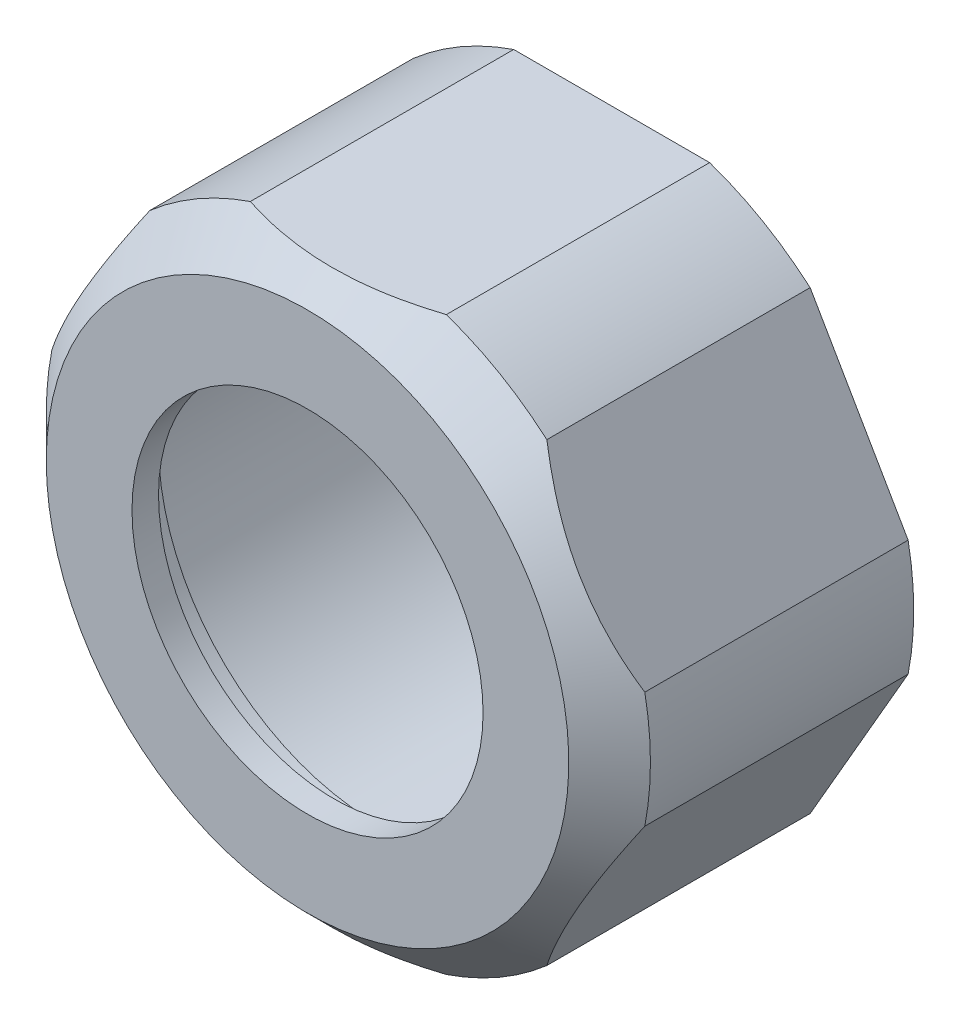
ISO-10303-21;
HEADER;
FILE_DESCRIPTION(('STEP AP214'),'2;1');
FILE_NAME('part.step','',(''),(''),'','','');
FILE_SCHEMA(('AUTOMOTIVE_DESIGN { 1 0 10303 214 1 1 1 1 }'));
ENDSEC;
DATA;
#1=APPLICATION_CONTEXT('core data for automotive mechanical design processes');
#2=APPLICATION_PROTOCOL_DEFINITION('international standard','automotive_design',2000,#1);
#3=PRODUCT_CONTEXT('',#1,'mechanical');
#4=PRODUCT('Part','Part','',(#3));
#5=PRODUCT_RELATED_PRODUCT_CATEGORY('part','',(#4));
#6=PRODUCT_DEFINITION_FORMATION('','',#4);
#7=PRODUCT_DEFINITION_CONTEXT('part definition',#1,'design');
#8=PRODUCT_DEFINITION('design','',#6,#7);
#9=PRODUCT_DEFINITION_SHAPE('','',#8);
#10=(LENGTH_UNIT() NAMED_UNIT(*) SI_UNIT(.MILLI.,.METRE.));
#11=(NAMED_UNIT(*) PLANE_ANGLE_UNIT() SI_UNIT($,.RADIAN.));
#12=(NAMED_UNIT(*) SI_UNIT($,.STERADIAN.) SOLID_ANGLE_UNIT());
#13=UNCERTAINTY_MEASURE_WITH_UNIT(LENGTH_MEASURE(1.E-05),#10,'distance_accuracy_value','');
#14=(GEOMETRIC_REPRESENTATION_CONTEXT(3) GLOBAL_UNCERTAINTY_ASSIGNED_CONTEXT((#13)) GLOBAL_UNIT_ASSIGNED_CONTEXT((#10,
#11,#12)) REPRESENTATION_CONTEXT('',''));
#15=CARTESIAN_POINT('',(0.,0.,0.));
#16=DIRECTION('',(0.,0.,1.));
#17=DIRECTION('',(1.,0.,0.));
#18=AXIS2_PLACEMENT_3D('',#15,#16,#17);
#19=CARTESIAN_POINT('',(0.,0.,0.));
#20=DIRECTION('',(0.,0.,-1.));
#21=DIRECTION('',(-1.,0.,0.));
#22=AXIS2_PLACEMENT_3D('',#19,#20,#21);
#23=CYLINDRICAL_SURFACE('',#22,7.4);
#24=DIRECTION('',(0.,0.,-1.));
#25=VECTOR('',#24,1.);
#26=CARTESIAN_POINT('',(7.26217782649107,-1.42153903091734,0.));
#27=LINE('',#26,#25);
#28=CARTESIAN_POINT('',(7.26217782649107,-1.42153903091734,0.));
#29=VERTEX_POINT('',#28);
#30=CARTESIAN_POINT('',(7.26217782649107,-1.42153903091734,6.45));
#31=VERTEX_POINT('',#30);
#32=EDGE_CURVE('E330',#29,#31,#27,.F.);
#33=ORIENTED_EDGE('',*,*,#32,.F.);
#34=CARTESIAN_POINT('',(0.,0.,0.));
#35=DIRECTION('',(0.,0.,-1.));
#36=DIRECTION('',(-1.,0.,0.));
#37=AXIS2_PLACEMENT_3D('',#34,#35,#36);
#38=CIRCLE('',#37,7.4);
#39=CARTESIAN_POINT('',(7.26217782649107,1.42153903091736,0.));
#40=VERTEX_POINT('',#39);
#41=EDGE_CURVE('E159',#40,#29,#38,.T.);
#42=ORIENTED_EDGE('',*,*,#41,.F.);
#43=DIRECTION('',(0.,0.,-1.));
#44=VECTOR('',#43,1.);
#45=CARTESIAN_POINT('',(7.26217782649107,1.42153903091735,0.));
#46=LINE('',#45,#44);
#47=CARTESIAN_POINT('',(7.26217782649107,1.42153903091735,6.45));
#48=VERTEX_POINT('',#47);
#49=EDGE_CURVE('E314',#48,#40,#46,.T.);
#50=ORIENTED_EDGE('',*,*,#49,.F.);
#51=CARTESIAN_POINT('',(0.,0.,6.45));
#52=DIRECTION('',(0.,0.,-1.));
#53=DIRECTION('',(-1.,0.,0.));
#54=AXIS2_PLACEMENT_3D('',#51,#52,#53);
#55=CIRCLE('',#54,7.4);
#56=EDGE_CURVE('E385',#48,#31,#55,.T.);
#57=ORIENTED_EDGE('',*,*,#56,.T.);
#58=EDGE_LOOP('',(#33,#42,#50,#57));
#59=FACE_BOUND('',#58,.T.);
#60=ADVANCED_FACE('F47',(#59),#23,.T.);
#61=DIRECTION('',(0.,0.,-1.));
#62=VECTOR('',#61,1.);
#63=CARTESIAN_POINT('',(4.86217782649107,5.57846096908265,0.));
#64=LINE('',#63,#62);
#65=CARTESIAN_POINT('',(4.86217782649107,5.57846096908265,0.));
#66=VERTEX_POINT('',#65);
#67=CARTESIAN_POINT('',(4.86217782649107,5.57846096908265,6.45));
#68=VERTEX_POINT('',#67);
#69=EDGE_CURVE('E313',#66,#68,#64,.F.);
#70=ORIENTED_EDGE('',*,*,#69,.F.);
#71=CARTESIAN_POINT('',(2.39999999999999,7.,0.));
#72=VERTEX_POINT('',#71);
#73=EDGE_CURVE('E162',#72,#66,#38,.T.);
#74=ORIENTED_EDGE('',*,*,#73,.F.);
#75=DIRECTION('',(0.,0.,-1.));
#76=VECTOR('',#75,1.);
#77=CARTESIAN_POINT('',(2.39999999999999,7.,0.));
#78=LINE('',#77,#76);
#79=CARTESIAN_POINT('',(2.39999999999999,7.,6.45));
#80=VERTEX_POINT('',#79);
#81=EDGE_CURVE('E257',#80,#72,#78,.T.);
#82=ORIENTED_EDGE('',*,*,#81,.F.);
#83=EDGE_CURVE('E383',#80,#68,#55,.T.);
#84=ORIENTED_EDGE('',*,*,#83,.T.);
#85=EDGE_LOOP('',(#70,#74,#82,#84));
#86=FACE_BOUND('',#85,.T.);
#87=ADVANCED_FACE('F208',(#86),#23,.T.);
#88=DIRECTION('',(0.,0.,-1.));
#89=VECTOR('',#88,1.);
#90=CARTESIAN_POINT('',(-2.39999999999999,7.,0.));
#91=LINE('',#90,#89);
#92=CARTESIAN_POINT('',(-2.39999999999999,7.,0.));
#93=VERTEX_POINT('',#92);
#94=CARTESIAN_POINT('',(-2.40000000000033,7.,6.45000000000016));
#95=VERTEX_POINT('',#94);
#96=EDGE_CURVE('E277',#93,#95,#91,.F.);
#97=ORIENTED_EDGE('',*,*,#96,.F.);
#98=CARTESIAN_POINT('',(-4.86217782649108,5.57846096908265,0.));
#99=VERTEX_POINT('',#98);
#100=EDGE_CURVE('E168',#99,#93,#38,.T.);
#101=ORIENTED_EDGE('',*,*,#100,.F.);
#102=DIRECTION('',(0.,0.,-1.));
#103=VECTOR('',#102,1.);
#104=CARTESIAN_POINT('',(-4.86217782649107,5.57846096908265,0.));
#105=LINE('',#104,#103);
#106=CARTESIAN_POINT('',(-4.86217782649107,5.57846096908265,6.45));
#107=VERTEX_POINT('',#106);
#108=EDGE_CURVE('E247',#107,#99,#105,.T.);
#109=ORIENTED_EDGE('',*,*,#108,.F.);
#110=EDGE_CURVE('E174',#107,#95,#55,.T.);
#111=ORIENTED_EDGE('',*,*,#110,.T.);
#112=EDGE_LOOP('',(#97,#101,#109,#111));
#113=FACE_BOUND('',#112,.T.);
#114=ADVANCED_FACE('F215',(#113),#23,.T.);
#115=DIRECTION('',(0.,0.,-1.));
#116=VECTOR('',#115,1.);
#117=CARTESIAN_POINT('',(-7.26217782649107,1.42153903091734,0.));
#118=LINE('',#117,#116);
#119=CARTESIAN_POINT('',(-7.26217782649107,1.42153903091735,0.));
#120=VERTEX_POINT('',#119);
#121=CARTESIAN_POINT('',(-7.26217782649107,1.42153903091734,6.45));
#122=VERTEX_POINT('',#121);
#123=EDGE_CURVE('E254',#120,#122,#118,.F.);
#124=ORIENTED_EDGE('',*,*,#123,.F.);
#125=CARTESIAN_POINT('',(-7.26217782649107,-1.42153903091735,0.));
#126=VERTEX_POINT('',#125);
#127=EDGE_CURVE('E163',#126,#120,#38,.T.);
#128=ORIENTED_EDGE('',*,*,#127,.F.);
#129=DIRECTION('',(0.,0.,-1.));
#130=VECTOR('',#129,1.);
#131=CARTESIAN_POINT('',(-7.26217782649107,-1.42153903091735,0.));
#132=LINE('',#131,#130);
#133=CARTESIAN_POINT('',(-7.26217782649107,-1.42153903091735,6.45));
#134=VERTEX_POINT('',#133);
#135=EDGE_CURVE('E62',#134,#126,#132,.T.);
#136=ORIENTED_EDGE('',*,*,#135,.F.);
#137=EDGE_CURVE('E170',#134,#122,#55,.T.);
#138=ORIENTED_EDGE('',*,*,#137,.T.);
#139=EDGE_LOOP('',(#124,#128,#136,#138));
#140=FACE_BOUND('',#139,.T.);
#141=ADVANCED_FACE('F233',(#140),#23,.T.);
#142=DIRECTION('',(0.,0.,-1.));
#143=VECTOR('',#142,1.);
#144=CARTESIAN_POINT('',(-4.86217782649107,-5.57846096908265,0.));
#145=LINE('',#144,#143);
#146=CARTESIAN_POINT('',(-4.86217782649107,-5.57846096908265,0.));
#147=VERTEX_POINT('',#146);
#148=CARTESIAN_POINT('',(-4.86217782649107,-5.57846096908265,6.45));
#149=VERTEX_POINT('',#148);
#150=EDGE_CURVE('E244',#147,#149,#145,.F.);
#151=ORIENTED_EDGE('',*,*,#150,.F.);
#152=CARTESIAN_POINT('',(-2.39999999999999,-7.,0.));
#153=VERTEX_POINT('',#152);
#154=EDGE_CURVE('E160',#153,#147,#38,.T.);
#155=ORIENTED_EDGE('',*,*,#154,.F.);
#156=DIRECTION('',(0.,0.,-1.));
#157=VECTOR('',#156,1.);
#158=CARTESIAN_POINT('',(-2.39999999999999,-7.,0.));
#159=LINE('',#158,#157);
#160=CARTESIAN_POINT('',(-2.39999999999999,-7.,6.45));
#161=VERTEX_POINT('',#160);
#162=EDGE_CURVE('E70',#161,#153,#159,.T.);
#163=ORIENTED_EDGE('',*,*,#162,.F.);
#164=EDGE_CURVE('E173',#161,#149,#55,.T.);
#165=ORIENTED_EDGE('',*,*,#164,.T.);
#166=EDGE_LOOP('',(#151,#155,#163,#165));
#167=FACE_BOUND('',#166,.T.);
#168=ADVANCED_FACE('F222',(#167),#23,.T.);
#169=CARTESIAN_POINT('',(0.,0.,6.8));
#170=DIRECTION('',(0.,0.,1.));
#171=DIRECTION('',(1.,0.,0.));
#172=AXIS2_PLACEMENT_3D('',#169,#170,#171);
#173=PLANE('',#172);
#174=CARTESIAN_POINT('',(0.,0.,6.8));
#175=DIRECTION('',(0.,0.,-1.));
#176=DIRECTION('',(-1.,0.,0.));
#177=AXIS2_PLACEMENT_3D('',#174,#175,#176);
#178=CIRCLE('',#177,4.3);
#179=CARTESIAN_POINT('',(-4.3,0.,6.8));
#180=VERTEX_POINT('',#179);
#181=EDGE_CURVE('E143',#180,#180,#178,.T.);
#182=ORIENTED_EDGE('',*,*,#181,.F.);
#183=EDGE_LOOP('',(#182));
#184=FACE_BOUND('',#183,.T.);
#185=CARTESIAN_POINT('',(0.,0.,6.8));
#186=DIRECTION('',(0.,0.,-1.));
#187=DIRECTION('',(-1.,0.,0.));
#188=AXIS2_PLACEMENT_3D('',#185,#186,#187);
#189=CIRCLE('',#188,5.35);
#190=CARTESIAN_POINT('',(-5.35,0.,6.8));
#191=VERTEX_POINT('',#190);
#192=EDGE_CURVE('E333',#191,#191,#189,.T.);
#193=ORIENTED_EDGE('',*,*,#192,.T.);
#194=EDGE_LOOP('',(#193));
#195=FACE_BOUND('',#194,.T.);
#196=ADVANCED_FACE('F232',(#184,#195),#173,.F.);
#197=CARTESIAN_POINT('',(0.,0.,0.));
#198=DIRECTION('',(0.,0.,-1.));
#199=DIRECTION('',(-1.,0.,0.));
#200=AXIS2_PLACEMENT_3D('',#197,#198,#199);
#201=CYLINDRICAL_SURFACE('',#200,4.3);
#202=CARTESIAN_POINT('',(0.,0.,7.45));
#203=DIRECTION('',(0.,0.,-1.));
#204=DIRECTION('',(-1.,0.,0.));
#205=AXIS2_PLACEMENT_3D('',#202,#203,#204);
#206=CIRCLE('',#205,4.3);
#207=CARTESIAN_POINT('',(-4.3,0.,7.45));
#208=VERTEX_POINT('',#207);
#209=EDGE_CURVE('E178',#208,#208,#206,.T.);
#210=ORIENTED_EDGE('',*,*,#209,.F.);
#211=EDGE_LOOP('',(#210));
#212=FACE_BOUND('',#211,.T.);
#213=ORIENTED_EDGE('',*,*,#181,.T.);
#214=EDGE_LOOP('',(#213));
#215=FACE_BOUND('',#214,.T.);
#216=ADVANCED_FACE('F239',(#212,#215),#201,.F.);
#217=CARTESIAN_POINT('',(0.,0.,7.45));
#218=DIRECTION('',(0.,0.,-1.));
#219=DIRECTION('',(-1.,0.,0.));
#220=AXIS2_PLACEMENT_3D('',#217,#218,#219);
#221=PLANE('',#220);
#222=CARTESIAN_POINT('',(0.,0.,7.45));
#223=DIRECTION('',(0.,0.,-1.));
#224=DIRECTION('',(-1.,0.,0.));
#225=AXIS2_PLACEMENT_3D('',#222,#223,#224);
#226=CIRCLE('',#225,6.4);
#227=CARTESIAN_POINT('',(-6.4,0.,7.45));
#228=VERTEX_POINT('',#227);
#229=EDGE_CURVE('E175',#228,#228,#226,.T.);
#230=ORIENTED_EDGE('',*,*,#229,.F.);
#231=EDGE_LOOP('',(#230));
#232=FACE_BOUND('',#231,.T.);
#233=ORIENTED_EDGE('',*,*,#209,.T.);
#234=EDGE_LOOP('',(#233));
#235=FACE_BOUND('',#234,.T.);
#236=ADVANCED_FACE('F229',(#232,#235),#221,.F.);
#237=CARTESIAN_POINT('',(0.,0.,7.45));
#238=DIRECTION('',(0.,0.,-1.));
#239=DIRECTION('',(-1.,0.,0.));
#240=AXIS2_PLACEMENT_3D('',#237,#238,#239);
#241=CONICAL_SURFACE('',#240,6.4,0.785398163397448);
#242=CARTESIAN_POINT('',(4.86217782649107,-5.57846096908265,6.45));
#243=VERTEX_POINT('',#242);
#244=CARTESIAN_POINT('',(2.40000000000001,-7.,6.45000000000001));
#245=VERTEX_POINT('',#244);
#246=EDGE_CURVE('E152',#243,#245,#55,.T.);
#247=ORIENTED_EDGE('',*,*,#246,.F.);
#248=CARTESIAN_POINT('',(4.86186952859424,-5.57899495670384,6.4498));
#249=CARTESIAN_POINT('',(4.94976807215587,-5.42675021334379,6.50686212349559));
#250=CARTESIAN_POINT('',(5.038540837437,-5.27299127354849,6.55882232049168));
#251=CARTESIAN_POINT('',(5.21767915355057,-4.96271460845745,6.6511906660003));
#252=CARTESIAN_POINT('',(5.30804642844767,-4.80619389699412,6.69158537883789));
#253=CARTESIAN_POINT('',(5.48782741571,-4.49480409282088,6.75852207481705));
#254=CARTESIAN_POINT('',(5.57721186959568,-4.33998567728408,6.78537358125416));
#255=CARTESIAN_POINT('',(5.75669073434499,-4.02911916465349,6.82564973183342));
#256=CARTESIAN_POINT('',(5.84678476282134,-3.87307172987389,6.83908116750244));
#257=CARTESIAN_POINT('',(6.04751017430972,-3.52540511880584,6.85341718827943));
#258=CARTESIAN_POINT('',(6.15820929643444,-3.33366861493256,6.85083055864892));
#259=CARTESIAN_POINT('',(6.379076950735,-2.95111461593543,6.8248317900697));
#260=CARTESIAN_POINT('',(6.48924489035629,-2.76029814714618,6.801400190649));
#261=CARTESIAN_POINT('',(6.71138823824439,-2.37553458204054,6.73408605907561));
#262=CARTESIAN_POINT('',(6.82331841876536,-2.18166582247786,6.68960989689539));
#263=CARTESIAN_POINT('',(6.98943214843874,-1.89394840284881,6.60930687257123));
#264=CARTESIAN_POINT('',(7.04447085454213,-1.79861856749488,6.58029793640393));
#265=CARTESIAN_POINT('',(7.15393823889617,-1.60901549602201,6.51809973071644));
#266=CARTESIAN_POINT('',(7.20836709042521,-1.5147419597761,6.48491168318731));
#267=CARTESIAN_POINT('',(7.26248612438791,-1.42100504329615,6.4498));
#268=B_SPLINE_CURVE_WITH_KNOTS('',3,(#248,#249,#250,#251,#252,#253,#254,#255,#256,#257,#258,
#259,#260,#261,#262,#263,#264,#265,#266,#267),.UNSPECIFIED.,.F.,.F.,(4,2,2,2,2,2,2,2,2,4),(0.,
0.554532613890152,1.10970684094149,1.65154173395759,2.19310228021327,2.85630121116493,
3.52011994268471,4.20389473394645,4.54533330867662,4.88667227605522),.UNSPECIFIED.);
#269=EDGE_CURVE('E323',#243,#31,#268,.T.);
#270=ORIENTED_EDGE('',*,*,#269,.T.);
#271=ORIENTED_EDGE('',*,*,#56,.F.);
#272=CARTESIAN_POINT('',(7.26248612438791,1.42100504329617,6.4498));
#273=CARTESIAN_POINT('',(7.17458758082628,1.57324978665621,6.50686212349559));
#274=CARTESIAN_POINT('',(7.08581481554515,1.72700872645151,6.55882232049168));
#275=CARTESIAN_POINT('',(6.90667649943158,2.03728539154255,6.6511906660003));
#276=CARTESIAN_POINT('',(6.81630922453447,2.19380610300588,6.69158537883789));
#277=CARTESIAN_POINT('',(6.63652823727215,2.50519590717912,6.75852207481704));
#278=CARTESIAN_POINT('',(6.54714378338647,2.66001432271592,6.78537358125416));
#279=CARTESIAN_POINT('',(6.36766491863715,2.97088083534651,6.82564973183342));
#280=CARTESIAN_POINT('',(6.2775708901608,3.12692827012611,6.83908116750244));
#281=CARTESIAN_POINT('',(6.07684547867242,3.47459488119416,6.85341718827943));
#282=CARTESIAN_POINT('',(5.9661463565477,3.66633138506744,6.85083055864892));
#283=CARTESIAN_POINT('',(5.74527870224714,4.04888538406457,6.8248317900697));
#284=CARTESIAN_POINT('',(5.63511076262585,4.23970185285382,6.801400190649));
#285=CARTESIAN_POINT('',(5.41296741473776,4.62446541795945,6.73408605907561));
#286=CARTESIAN_POINT('',(5.30103723421678,4.81833417752214,6.68960989689539));
#287=CARTESIAN_POINT('',(5.13492350454341,5.10605159715118,6.60930687257123));
#288=CARTESIAN_POINT('',(5.07988479844001,5.20138143250512,6.58029793640393));
#289=CARTESIAN_POINT('',(4.97041741408597,5.39098450397798,6.51809973071644));
#290=CARTESIAN_POINT('',(4.91598856255694,5.48525804022389,6.48491168318731));
#291=CARTESIAN_POINT('',(4.86186952859423,5.57899495670384,6.4498));
#292=B_SPLINE_CURVE_WITH_KNOTS('',3,(#272,#273,#274,#275,#276,#277,#278,#279,#280,#281,#282,
#283,#284,#285,#286,#287,#288,#289,#290,#291),.UNSPECIFIED.,.F.,.F.,(4,2,2,2,2,2,2,2,2,4),(0.,
0.554532613890153,1.10970684094149,1.65154173395759,2.19310228021327,2.85630121116493,
3.52011994268471,4.20389473394645,4.54533330867661,4.88667227605521),.UNSPECIFIED.);
#293=EDGE_CURVE('E306',#48,#68,#292,.T.);
#294=ORIENTED_EDGE('',*,*,#293,.T.);
#295=ORIENTED_EDGE('',*,*,#83,.F.);
#296=CARTESIAN_POINT('',(-7.92504676644809,7.,3.27614704800613));
#297=CARTESIAN_POINT('',(-7.73145880273794,7.,3.42120708200767));
#298=CARTESIAN_POINT('',(-7.53677200196737,7.,3.56482483959564));
#299=CARTESIAN_POINT('',(-7.14477317705814,7.,3.84853500702831));
#300=CARTESIAN_POINT('',(-6.94746049218691,7.,3.98862650292775));
#301=CARTESIAN_POINT('',(-6.54833992386364,7.,4.26563802014608));
#302=CARTESIAN_POINT('',(-6.3465090482534,7.,4.40252502796737));
#303=CARTESIAN_POINT('',(-5.9393988109034,7.,4.67105470618573));
#304=CARTESIAN_POINT('',(-5.73411969692491,7.,4.80269775109758));
#305=CARTESIAN_POINT('',(-5.30819193245006,7.,5.0666386371959));
#306=CARTESIAN_POINT('',(-5.0873183579922,7.,5.19857536410924));
#307=CARTESIAN_POINT('',(-4.64043112249518,7.,5.45357697260141));
#308=CARTESIAN_POINT('',(-4.41441667296481,7.,5.57664048099831));
#309=CARTESIAN_POINT('',(-3.95729935686741,7.,5.81122817642862));
#310=CARTESIAN_POINT('',(-3.72621403894786,7.,5.92278629087427));
#311=CARTESIAN_POINT('',(-3.25783007596519,7.,6.13186704716565));
#312=CARTESIAN_POINT('',(-3.02053425519229,7.,6.22939594222717));
#313=CARTESIAN_POINT('',(-2.55705632509784,7.,6.40045997462642));
#314=CARTESIAN_POINT('',(-2.3313347992217,7.,6.4752299464502));
#315=CARTESIAN_POINT('',(-1.87457558517493,7.,6.60664150936022));
#316=CARTESIAN_POINT('',(-1.64353752064898,7.,6.6632818127977));
#317=CARTESIAN_POINT('',(-1.18130345302649,7.,6.75457168951818));
#318=CARTESIAN_POINT('',(-0.950181455227695,7.,6.7895899317552));
#319=CARTESIAN_POINT('',(-0.485615333614886,7.,6.83697721056554));
#320=CARTESIAN_POINT('',(-0.252171587577657,7.,6.84934987313764));
#321=CARTESIAN_POINT('',(0.206901970221736,7.,6.85057909937697));
#322=CARTESIAN_POINT('',(0.4325300114722,7.,6.84021404784324));
#323=CARTESIAN_POINT('',(0.88178667800732,7.,6.79822741999502));
#324=CARTESIAN_POINT('',(1.10541510283781,7.,6.76660373626053));
#325=CARTESIAN_POINT('',(1.55283294286486,7.,6.68326409136826));
#326=CARTESIAN_POINT('',(1.77655853347941,7.,6.63121080200843));
#327=CARTESIAN_POINT('',(2.21915086664105,7.,6.50974755418119));
#328=CARTESIAN_POINT('',(2.43801805916092,7.,6.44033921046005));
#329=CARTESIAN_POINT('',(2.89387366955189,7.,6.27872000792734));
#330=CARTESIAN_POINT('',(3.13027074789909,7.,6.18485724752258));
#331=CARTESIAN_POINT('',(3.59689624374627,7.,5.98276445096363));
#332=CARTESIAN_POINT('',(3.82712168649775,7.,5.87452763096779));
#333=CARTESIAN_POINT('',(4.28254602382106,7.,5.64626627103667));
#334=CARTESIAN_POINT('',(4.50772607330991,7.,5.52620443341423));
#335=CARTESIAN_POINT('',(4.95289406517991,7.,5.27695167784541));
#336=CARTESIAN_POINT('',(5.17288283722881,7.,5.14776223203272));
#337=CARTESIAN_POINT('',(5.5974830133362,7.,4.88869608223382));
#338=CARTESIAN_POINT('',(5.80231344011651,7.,4.75917645522363));
#339=CARTESIAN_POINT('',(6.20845936875948,7.,4.49472196578262));
#340=CARTESIAN_POINT('',(6.40977460166546,7.,4.35978669156933));
#341=CARTESIAN_POINT('',(6.80771207496359,7.,4.08659148577775));
#342=CARTESIAN_POINT('',(7.00435921011208,7.,3.94836768635172));
#343=CARTESIAN_POINT('',(7.39497110803255,7.,3.66828813322702));
#344=CARTESIAN_POINT('',(7.58893659254053,7.,3.52643338726384));
#345=CARTESIAN_POINT('',(7.78178005875042,7.,3.38309497115954));
#346=B_SPLINE_CURVE_WITH_KNOTS('',3,(#296,#297,#298,#299,#300,#301,#302,#303,#304,#305,#306,
#307,#308,#309,#310,#311,#312,#313,#314,#315,#316,#317,#318,#319,#320,#321,#322,#323,#324,#325,
#326,#327,#328,#329,#330,#331,#332,#333,#334,#335,#336,#337,#338,#339,#340,#341,#342,#343,#344,
#345),.UNSPECIFIED.,.F.,.F.,(4,2,2,2,2,2,2,2,2,2,2,2,2,2,2,2,2,2,2,2,2,2,2,2,4),(0.,
0.725733991453925,1.45165418300578,2.18320301713488,2.91469951129523,3.68637048652214,
4.45816062711745,5.22760558568099,5.99670651125404,6.709424083135,7.42219226412534,
8.12244505640332,8.82258571474541,9.49913336841657,10.175748099797,10.8640396498943,
11.5522671838902,12.3147184749594,13.0775308924891,13.8428314564169,14.6080088704276,
15.3349420126407,16.0619305328228,16.7829844326093,17.5038403352653),.UNSPECIFIED.);
#347=EDGE_CURVE('E260',#80,#95,#346,.F.);
#348=ORIENTED_EDGE('',*,*,#347,.T.);
#349=ORIENTED_EDGE('',*,*,#110,.F.);
#350=CARTESIAN_POINT('',(-4.86186952859424,5.57899495670384,6.4498));
#351=CARTESIAN_POINT('',(-4.94976807215587,5.42675021334379,6.50686212349559));
#352=CARTESIAN_POINT('',(-5.03854083743699,5.27299127354849,6.55882232049168));
#353=CARTESIAN_POINT('',(-5.21767915355056,4.96271460845745,6.6511906660003));
#354=CARTESIAN_POINT('',(-5.30804642844767,4.80619389699412,6.69158537883789));
#355=CARTESIAN_POINT('',(-5.48782741570999,4.49480409282088,6.75852207481705));
#356=CARTESIAN_POINT('',(-5.57721186959568,4.33998567728408,6.78537358125416));
#357=CARTESIAN_POINT('',(-5.75669073434499,4.02911916465349,6.82564973183342));
#358=CARTESIAN_POINT('',(-5.84678476282134,3.87307172987389,6.83908116750244));
#359=CARTESIAN_POINT('',(-6.04751017430972,3.52540511880585,6.85341718827943));
#360=CARTESIAN_POINT('',(-6.15820929643444,3.33366861493256,6.85083055864892));
#361=CARTESIAN_POINT('',(-6.379076950735,2.95111461593543,6.8248317900697));
#362=CARTESIAN_POINT('',(-6.48924489035629,2.76029814714618,6.801400190649));
#363=CARTESIAN_POINT('',(-6.71138823824439,2.37553458204055,6.73408605907561));
#364=CARTESIAN_POINT('',(-6.82331841876536,2.18166582247786,6.68960989689539));
#365=CARTESIAN_POINT('',(-6.98943214843874,1.89394840284881,6.60930687257123));
#366=CARTESIAN_POINT('',(-7.04447085454213,1.79861856749488,6.58029793640393));
#367=CARTESIAN_POINT('',(-7.15393823889617,1.60901549602201,6.51809973071644));
#368=CARTESIAN_POINT('',(-7.2083670904252,1.5147419597761,6.48491168318731));
#369=CARTESIAN_POINT('',(-7.26248612438791,1.42100504329615,6.4498));
#370=B_SPLINE_CURVE_WITH_KNOTS('',3,(#350,#351,#352,#353,#354,#355,#356,#357,#358,#359,#360,
#361,#362,#363,#364,#365,#366,#367,#368,#369),.UNSPECIFIED.,.F.,.F.,(4,2,2,2,2,2,2,2,2,4),(0.,
0.554532613890153,1.10970684094149,1.65154173395759,2.19310228021327,2.85630121116493,
3.52011994268471,4.20389473394645,4.54533330867662,4.88667227605522),.UNSPECIFIED.);
#371=EDGE_CURVE('E258',#107,#122,#370,.T.);
#372=ORIENTED_EDGE('',*,*,#371,.T.);
#373=ORIENTED_EDGE('',*,*,#137,.F.);
#374=CARTESIAN_POINT('',(-7.26248612438791,-1.42100504329616,6.4498));
#375=CARTESIAN_POINT('',(-7.17458758082628,-1.57324978665621,6.50686212349559));
#376=CARTESIAN_POINT('',(-7.08581481554515,-1.72700872645151,6.55882232049168));
#377=CARTESIAN_POINT('',(-6.90667649943158,-2.03728539154255,6.65119066600031));
#378=CARTESIAN_POINT('',(-6.81630922453447,-2.19380610300588,6.69158537883789));
#379=CARTESIAN_POINT('',(-6.63652823727215,-2.50519590717912,6.75852207481704));
#380=CARTESIAN_POINT('',(-6.54714378338647,-2.66001432271592,6.78537358125416));
#381=CARTESIAN_POINT('',(-6.36766491863715,-2.97088083534651,6.82564973183342));
#382=CARTESIAN_POINT('',(-6.2775708901608,-3.12692827012611,6.83908116750244));
#383=CARTESIAN_POINT('',(-6.07684547867242,-3.47459488119416,6.85341718827943));
#384=CARTESIAN_POINT('',(-5.9661463565477,-3.66633138506744,6.85083055864892));
#385=CARTESIAN_POINT('',(-5.74527870224714,-4.04888538406457,6.8248317900697));
#386=CARTESIAN_POINT('',(-5.63511076262585,-4.23970185285382,6.801400190649));
#387=CARTESIAN_POINT('',(-5.41296741473775,-4.62446541795945,6.73408605907561));
#388=CARTESIAN_POINT('',(-5.30103723421678,-4.81833417752214,6.68960989689539));
#389=CARTESIAN_POINT('',(-5.1349235045434,-5.10605159715118,6.60930687257123));
#390=CARTESIAN_POINT('',(-5.07988479844001,-5.20138143250512,6.58029793640393));
#391=CARTESIAN_POINT('',(-4.97041741408597,-5.39098450397798,6.51809973071644));
#392=CARTESIAN_POINT('',(-4.91598856255694,-5.48525804022389,6.48491168318731));
#393=CARTESIAN_POINT('',(-4.86186952859423,-5.57899495670384,6.4498));
#394=B_SPLINE_CURVE_WITH_KNOTS('',3,(#374,#375,#376,#377,#378,#379,#380,#381,#382,#383,#384,
#385,#386,#387,#388,#389,#390,#391,#392,#393),.UNSPECIFIED.,.F.,.F.,(4,2,2,2,2,2,2,2,2,4),(0.,
0.554532613890153,1.10970684094149,1.65154173395759,2.19310228021327,2.85630121116493,
3.52011994268471,4.20389473394645,4.54533330867661,4.88667227605522),.UNSPECIFIED.);
#395=EDGE_CURVE('E248',#134,#149,#394,.T.);
#396=ORIENTED_EDGE('',*,*,#395,.T.);
#397=ORIENTED_EDGE('',*,*,#164,.F.);
#398=CARTESIAN_POINT('',(-7.92504676644809,-7.,3.27614704800614));
#399=CARTESIAN_POINT('',(-7.73145880273793,-7.,3.42120708200768));
#400=CARTESIAN_POINT('',(-7.53677200196737,-7.,3.56482483959564));
#401=CARTESIAN_POINT('',(-7.14477317705813,-7.,3.84853500702831));
#402=CARTESIAN_POINT('',(-6.94746049218691,-7.,3.98862650292776));
#403=CARTESIAN_POINT('',(-6.54833992386363,-7.,4.26563802014608));
#404=CARTESIAN_POINT('',(-6.34650904825339,-7.,4.40252502796737));
#405=CARTESIAN_POINT('',(-5.9393988109034,-7.,4.67105470618573));
#406=CARTESIAN_POINT('',(-5.7341196969249,-7.,4.80269775109758));
#407=CARTESIAN_POINT('',(-5.30819193245005,-7.,5.0666386371959));
#408=CARTESIAN_POINT('',(-5.0873183579922,-7.,5.19857536410925));
#409=CARTESIAN_POINT('',(-4.64043112249517,-7.,5.45357697260141));
#410=CARTESIAN_POINT('',(-4.41441667296481,-7.,5.57664048099831));
#411=CARTESIAN_POINT('',(-3.9572993568674,-7.,5.81122817642862));
#412=CARTESIAN_POINT('',(-3.72621403894785,-7.,5.92278629087427));
#413=CARTESIAN_POINT('',(-3.25783007596518,-7.,6.13186704716565));
#414=CARTESIAN_POINT('',(-3.02053425519228,-7.,6.22939594222717));
#415=CARTESIAN_POINT('',(-2.55705632509784,-7.,6.40045997462643));
#416=CARTESIAN_POINT('',(-2.33133479922169,-7.,6.4752299464502));
#417=CARTESIAN_POINT('',(-1.87457558517493,-7.,6.60664150936022));
#418=CARTESIAN_POINT('',(-1.64353752064897,-7.,6.6632818127977));
#419=CARTESIAN_POINT('',(-1.18130345302649,-7.,6.75457168951818));
#420=CARTESIAN_POINT('',(-0.95018145522769,-7.,6.7895899317552));
#421=CARTESIAN_POINT('',(-0.48561533361488,-7.,6.83697721056554));
#422=CARTESIAN_POINT('',(-0.252171587577651,-7.,6.84934987313764));
#423=CARTESIAN_POINT('',(0.206901970221742,-7.,6.85057909937697));
#424=CARTESIAN_POINT('',(0.432530011472206,-7.,6.84021404784324));
#425=CARTESIAN_POINT('',(0.881786678007326,-7.,6.79822741999502));
#426=CARTESIAN_POINT('',(1.10541510283782,-7.,6.76660373626053));
#427=CARTESIAN_POINT('',(1.55283294286486,-7.,6.68326409136826));
#428=CARTESIAN_POINT('',(1.77655853347941,-7.,6.63121080200843));
#429=CARTESIAN_POINT('',(2.21915086664106,-7.,6.50974755418119));
#430=CARTESIAN_POINT('',(2.43801805916093,-7.,6.44033921046005));
#431=CARTESIAN_POINT('',(2.8938736695519,-7.,6.27872000792734));
#432=CARTESIAN_POINT('',(3.1302707478991,-7.,6.18485724752258));
#433=CARTESIAN_POINT('',(3.59689624374628,-7.,5.98276445096363));
#434=CARTESIAN_POINT('',(3.82712168649776,-7.,5.87452763096778));
#435=CARTESIAN_POINT('',(4.28254602382107,-7.,5.64626627103667));
#436=CARTESIAN_POINT('',(4.50772607330992,-7.,5.52620443341423));
#437=CARTESIAN_POINT('',(4.95289406517992,-7.,5.2769516778454));
#438=CARTESIAN_POINT('',(5.17288283722882,-7.,5.14776223203271));
#439=CARTESIAN_POINT('',(5.59748301333621,-7.,4.88869608223382));
#440=CARTESIAN_POINT('',(5.80231344011652,-7.,4.75917645522363));
#441=CARTESIAN_POINT('',(6.20845936875949,-7.,4.49472196578262));
#442=CARTESIAN_POINT('',(6.40977460166547,-7.,4.35978669156933));
#443=CARTESIAN_POINT('',(6.8077120749636,-7.,4.08659148577774));
#444=CARTESIAN_POINT('',(7.00435921011209,-7.,3.94836768635171));
#445=CARTESIAN_POINT('',(7.39497110803256,-7.,3.66828813322701));
#446=CARTESIAN_POINT('',(7.58893659254054,-7.,3.52643338726383));
#447=CARTESIAN_POINT('',(7.78178005875043,-7.,3.38309497115954));
#448=B_SPLINE_CURVE_WITH_KNOTS('',3,(#398,#399,#400,#401,#402,#403,#404,#405,#406,#407,#408,
#409,#410,#411,#412,#413,#414,#415,#416,#417,#418,#419,#420,#421,#422,#423,#424,#425,#426,#427,
#428,#429,#430,#431,#432,#433,#434,#435,#436,#437,#438,#439,#440,#441,#442,#443,#444,#445,#446,
#447),.UNSPECIFIED.,.F.,.F.,(4,2,2,2,2,2,2,2,2,2,2,2,2,2,2,2,2,2,2,2,2,2,2,2,4),(0.,
0.725733991453924,1.45165418300578,2.18320301713488,2.91469951129523,3.68637048652214,
4.45816062711745,5.22760558568099,5.99670651125404,6.709424083135,7.42219226412534,
8.12244505640332,8.82258571474541,9.49913336841657,10.175748099797,10.8640396498943,
11.5522671838902,12.3147184749594,13.0775308924891,13.8428314564169,14.6080088704276,
15.3349420126407,16.0619305328228,16.7829844326093,17.5038403352653),.UNSPECIFIED.);
#449=EDGE_CURVE('E153',#161,#245,#448,.T.);
#450=ORIENTED_EDGE('',*,*,#449,.T.);
#451=EDGE_LOOP('',(#247,#270,#271,#294,#295,#348,#349,#372,#373,#396,#397,#450));
#452=FACE_BOUND('',#451,.T.);
#453=ORIENTED_EDGE('',*,*,#229,.T.);
#454=EDGE_LOOP('',(#453));
#455=FACE_BOUND('',#454,.T.);
#456=ADVANCED_FACE('F221',(#452,#455),#241,.T.);
#457=DIRECTION('',(0.,0.,-1.));
#458=VECTOR('',#457,1.);
#459=CARTESIAN_POINT('',(4.86217782649107,-5.57846096908265,0.));
#460=LINE('',#459,#458);
#461=CARTESIAN_POINT('',(4.86217782649108,-5.57846096908265,0.));
#462=VERTEX_POINT('',#461);
#463=EDGE_CURVE('E331',#243,#462,#460,.T.);
#464=ORIENTED_EDGE('',*,*,#463,.F.);
#465=ORIENTED_EDGE('',*,*,#246,.T.);
#466=DIRECTION('',(0.,0.,-1.));
#467=VECTOR('',#466,1.);
#468=CARTESIAN_POINT('',(2.39999999999999,-7.,0.));
#469=LINE('',#468,#467);
#470=CARTESIAN_POINT('',(2.39999999999999,-7.,0.));
#471=VERTEX_POINT('',#470);
#472=EDGE_CURVE('E136',#471,#245,#469,.F.);
#473=ORIENTED_EDGE('',*,*,#472,.F.);
#474=EDGE_CURVE('E150',#462,#471,#38,.T.);
#475=ORIENTED_EDGE('',*,*,#474,.F.);
#476=EDGE_LOOP('',(#464,#465,#473,#475));
#477=FACE_BOUND('',#476,.T.);
#478=ADVANCED_FACE('F149',(#477),#23,.T.);
#479=CARTESIAN_POINT('',(0.,0.,0.));
#480=DIRECTION('',(0.,0.,-1.));
#481=DIRECTION('',(-1.,0.,0.));
#482=AXIS2_PLACEMENT_3D('',#479,#480,#481);
#483=PLANE('',#482);
#484=CARTESIAN_POINT('',(0.,0.,0.));
#485=DIRECTION('',(0.,0.,-1.));
#486=DIRECTION('',(-1.,0.,0.));
#487=AXIS2_PLACEMENT_3D('',#484,#485,#486);
#488=CIRCLE('',#487,5.95);
#489=CARTESIAN_POINT('',(-5.95,0.,0.));
#490=VERTEX_POINT('',#489);
#491=EDGE_CURVE('E11',#490,#490,#488,.F.);
#492=ORIENTED_EDGE('',*,*,#491,.T.);
#493=EDGE_LOOP('',(#492));
#494=FACE_BOUND('',#493,.T.);
#495=DIRECTION('',(0.499999999999999,0.866025403784439,0.));
#496=VECTOR('',#495,1.);
#497=CARTESIAN_POINT('',(6.06217782649107,-3.49999999999999,0.));
#498=LINE('',#497,#496);
#499=EDGE_CURVE('E158',#462,#29,#498,.T.);
#500=ORIENTED_EDGE('',*,*,#499,.F.);
#501=ORIENTED_EDGE('',*,*,#474,.T.);
#502=DIRECTION('',(1.,0.,0.));
#503=VECTOR('',#502,1.);
#504=CARTESIAN_POINT('',(0.,-7.,0.));
#505=LINE('',#504,#503);
#506=EDGE_CURVE('E133',#153,#471,#505,.T.);
#507=ORIENTED_EDGE('',*,*,#506,.F.);
#508=ORIENTED_EDGE('',*,*,#154,.T.);
#509=DIRECTION('',(0.5,-0.866025403784438,0.));
#510=VECTOR('',#509,1.);
#511=CARTESIAN_POINT('',(-6.06217782649107,-3.5,0.));
#512=LINE('',#511,#510);
#513=EDGE_CURVE('E142',#126,#147,#512,.T.);
#514=ORIENTED_EDGE('',*,*,#513,.F.);
#515=ORIENTED_EDGE('',*,*,#127,.T.);
#516=DIRECTION('',(-0.5,-0.866025403784439,0.));
#517=VECTOR('',#516,1.);
#518=CARTESIAN_POINT('',(-6.06217782649107,3.5,0.));
#519=LINE('',#518,#517);
#520=EDGE_CURVE('E184',#99,#120,#519,.T.);
#521=ORIENTED_EDGE('',*,*,#520,.F.);
#522=ORIENTED_EDGE('',*,*,#100,.T.);
#523=DIRECTION('',(-1.,0.,0.));
#524=VECTOR('',#523,1.);
#525=CARTESIAN_POINT('',(0.,7.,0.));
#526=LINE('',#525,#524);
#527=EDGE_CURVE('E186',#72,#93,#526,.T.);
#528=ORIENTED_EDGE('',*,*,#527,.F.);
#529=ORIENTED_EDGE('',*,*,#73,.T.);
#530=DIRECTION('',(-0.5,0.866025403784439,0.));
#531=VECTOR('',#530,1.);
#532=CARTESIAN_POINT('',(6.06217782649107,3.5,0.));
#533=LINE('',#532,#531);
#534=EDGE_CURVE('E188',#40,#66,#533,.T.);
#535=ORIENTED_EDGE('',*,*,#534,.F.);
#536=ORIENTED_EDGE('',*,*,#41,.T.);
#537=EDGE_LOOP('',(#500,#501,#507,#508,#514,#515,#521,#522,#528,#529,#535,#536));
#538=FACE_BOUND('',#537,.T.);
#539=ADVANCED_FACE('F156',(#494,#538),#483,.T.);
#540=CARTESIAN_POINT('',(0.,0.,0.));
#541=DIRECTION('',(0.,0.,-1.));
#542=DIRECTION('',(-1.,0.,0.));
#543=AXIS2_PLACEMENT_3D('',#540,#541,#542);
#544=CYLINDRICAL_SURFACE('',#543,5.65);
#545=CARTESIAN_POINT('',(0.,0.,0.299999999999997));
#546=DIRECTION('',(0.,0.,-1.));
#547=DIRECTION('',(-1.,0.,0.));
#548=AXIS2_PLACEMENT_3D('',#545,#546,#547);
#549=CIRCLE('',#548,5.65);
#550=CARTESIAN_POINT('',(-5.65,0.,0.299999999999998));
#551=VERTEX_POINT('',#550);
#552=EDGE_CURVE('E55',#551,#551,#549,.T.);
#553=ORIENTED_EDGE('',*,*,#552,.T.);
#554=EDGE_LOOP('',(#553));
#555=FACE_BOUND('',#554,.T.);
#556=CARTESIAN_POINT('',(0.,0.,5.75));
#557=DIRECTION('',(0.,0.,-1.));
#558=DIRECTION('',(-1.,0.,0.));
#559=AXIS2_PLACEMENT_3D('',#556,#557,#558);
#560=CIRCLE('',#559,5.65);
#561=CARTESIAN_POINT('',(-5.65,0.,5.75));
#562=VERTEX_POINT('',#561);
#563=EDGE_CURVE('E167',#562,#562,#560,.T.);
#564=ORIENTED_EDGE('',*,*,#563,.F.);
#565=EDGE_LOOP('',(#564));
#566=FACE_BOUND('',#565,.T.);
#567=ADVANCED_FACE('F193',(#555,#566),#544,.F.);
#568=CARTESIAN_POINT('',(0.,0.,5.75));
#569=DIRECTION('',(0.,0.,1.));
#570=DIRECTION('',(1.,0.,0.));
#571=AXIS2_PLACEMENT_3D('',#568,#569,#570);
#572=PLANE('',#571);
#573=CARTESIAN_POINT('',(0.,0.,5.75));
#574=DIRECTION('',(0.,0.,-1.));
#575=DIRECTION('',(-1.,0.,0.));
#576=AXIS2_PLACEMENT_3D('',#573,#574,#575);
#577=CIRCLE('',#576,5.35);
#578=CARTESIAN_POINT('',(-5.35,0.,5.75));
#579=VERTEX_POINT('',#578);
#580=EDGE_CURVE('E335',#579,#579,#577,.T.);
#581=ORIENTED_EDGE('',*,*,#580,.F.);
#582=EDGE_LOOP('',(#581));
#583=FACE_BOUND('',#582,.T.);
#584=ORIENTED_EDGE('',*,*,#563,.T.);
#585=EDGE_LOOP('',(#584));
#586=FACE_BOUND('',#585,.T.);
#587=ADVANCED_FACE('F342',(#583,#586),#572,.F.);
#588=CARTESIAN_POINT('',(0.,0.,0.));
#589=DIRECTION('',(0.,0.,-1.));
#590=DIRECTION('',(-1.,0.,0.));
#591=AXIS2_PLACEMENT_3D('',#588,#589,#590);
#592=CYLINDRICAL_SURFACE('',#591,5.35);
#593=ORIENTED_EDGE('',*,*,#192,.F.);
#594=EDGE_LOOP('',(#593));
#595=FACE_BOUND('',#594,.T.);
#596=ORIENTED_EDGE('',*,*,#580,.T.);
#597=EDGE_LOOP('',(#596));
#598=FACE_BOUND('',#597,.T.);
#599=ADVANCED_FACE('F321',(#595,#598),#592,.F.);
#600=CARTESIAN_POINT('',(-4.04145188432738,-7.,7.45));
#601=DIRECTION('',(0.,1.,0.));
#602=DIRECTION('',(-1.,0.,0.));
#603=AXIS2_PLACEMENT_3D('',#600,#601,#602);
#604=PLANE('',#603);
#605=ORIENTED_EDGE('',*,*,#472,.T.);
#606=ORIENTED_EDGE('',*,*,#449,.F.);
#607=ORIENTED_EDGE('',*,*,#162,.T.);
#608=ORIENTED_EDGE('',*,*,#506,.T.);
#609=EDGE_LOOP('',(#605,#606,#607,#608));
#610=FACE_BOUND('',#609,.T.);
#611=ADVANCED_FACE('F135',(#610),#604,.F.);
#612=CARTESIAN_POINT('',(-8.08290376865476,0.,7.45));
#613=DIRECTION('',(0.866025403784438,0.5,0.));
#614=DIRECTION('',(-0.5,0.866025403784438,0.));
#615=AXIS2_PLACEMENT_3D('',#612,#613,#614);
#616=PLANE('',#615);
#617=ORIENTED_EDGE('',*,*,#150,.T.);
#618=ORIENTED_EDGE('',*,*,#395,.F.);
#619=ORIENTED_EDGE('',*,*,#135,.T.);
#620=ORIENTED_EDGE('',*,*,#513,.T.);
#621=EDGE_LOOP('',(#617,#618,#619,#620));
#622=FACE_BOUND('',#621,.T.);
#623=ADVANCED_FACE('F355',(#622),#616,.F.);
#624=CARTESIAN_POINT('',(-4.04145188432738,7.,7.45));
#625=DIRECTION('',(0.866025403784439,-0.499999999999999,0.));
#626=DIRECTION('',(0.5,0.866025403784439,0.));
#627=AXIS2_PLACEMENT_3D('',#624,#625,#626);
#628=PLANE('',#627);
#629=ORIENTED_EDGE('',*,*,#123,.T.);
#630=ORIENTED_EDGE('',*,*,#371,.F.);
#631=ORIENTED_EDGE('',*,*,#108,.T.);
#632=ORIENTED_EDGE('',*,*,#520,.T.);
#633=EDGE_LOOP('',(#629,#630,#631,#632));
#634=FACE_BOUND('',#633,.T.);
#635=ADVANCED_FACE('F361',(#634),#628,.F.);
#636=CARTESIAN_POINT('',(4.04145188432738,7.,7.45));
#637=DIRECTION('',(0.,-1.,0.));
#638=DIRECTION('',(1.,0.,0.));
#639=AXIS2_PLACEMENT_3D('',#636,#637,#638);
#640=PLANE('',#639);
#641=ORIENTED_EDGE('',*,*,#96,.T.);
#642=ORIENTED_EDGE('',*,*,#347,.F.);
#643=ORIENTED_EDGE('',*,*,#81,.T.);
#644=ORIENTED_EDGE('',*,*,#527,.T.);
#645=EDGE_LOOP('',(#641,#642,#643,#644));
#646=FACE_BOUND('',#645,.T.);
#647=ADVANCED_FACE('F279',(#646),#640,.F.);
#648=CARTESIAN_POINT('',(8.08290376865476,0.,7.45));
#649=DIRECTION('',(-0.866025403784438,-0.5,0.));
#650=DIRECTION('',(0.5,-0.866025403784439,0.));
#651=AXIS2_PLACEMENT_3D('',#648,#649,#650);
#652=PLANE('',#651);
#653=ORIENTED_EDGE('',*,*,#69,.T.);
#654=ORIENTED_EDGE('',*,*,#293,.F.);
#655=ORIENTED_EDGE('',*,*,#49,.T.);
#656=ORIENTED_EDGE('',*,*,#534,.T.);
#657=EDGE_LOOP('',(#653,#654,#655,#656));
#658=FACE_BOUND('',#657,.T.);
#659=ADVANCED_FACE('F203',(#658),#652,.F.);
#660=CARTESIAN_POINT('',(4.04145188432738,-7.,7.45));
#661=DIRECTION('',(-0.866025403784439,0.499999999999999,0.));
#662=DIRECTION('',(-0.499999999999999,-0.866025403784439,0.));
#663=AXIS2_PLACEMENT_3D('',#660,#661,#662);
#664=PLANE('',#663);
#665=ORIENTED_EDGE('',*,*,#32,.T.);
#666=ORIENTED_EDGE('',*,*,#269,.F.);
#667=ORIENTED_EDGE('',*,*,#463,.T.);
#668=ORIENTED_EDGE('',*,*,#499,.T.);
#669=EDGE_LOOP('',(#665,#666,#667,#668));
#670=FACE_BOUND('',#669,.T.);
#671=ADVANCED_FACE('F197',(#670),#664,.F.);
#672=CARTESIAN_POINT('',(0.,0.,0.299999999999997));
#673=DIRECTION('',(0.,0.,-1.));
#674=DIRECTION('',(-1.,0.,0.));
#675=AXIS2_PLACEMENT_3D('',#672,#673,#674);
#676=CONICAL_SURFACE('',#675,5.65,0.785398163397453);
#677=ORIENTED_EDGE('',*,*,#491,.F.);
#678=EDGE_LOOP('',(#677));
#679=FACE_BOUND('',#678,.T.);
#680=ORIENTED_EDGE('',*,*,#552,.F.);
#681=EDGE_LOOP('',(#680));
#682=FACE_BOUND('',#681,.T.);
#683=ADVANCED_FACE('F49',(#679,#682),#676,.F.);
#684=CLOSED_SHELL('',(#60,#87,#114,#141,#168,#196,#216,#236,#456,#478,#539,#567,#587,#599,#611,
#623,#635,#647,#659,#671,#683));
#685=MANIFOLD_SOLID_BREP('B2',#684);
#686=ADVANCED_BREP_SHAPE_REPRESENTATION('',(#18,#685),#14);
#687=SHAPE_DEFINITION_REPRESENTATION(#9,#686);
ENDSEC;
END-ISO-10303-21;
